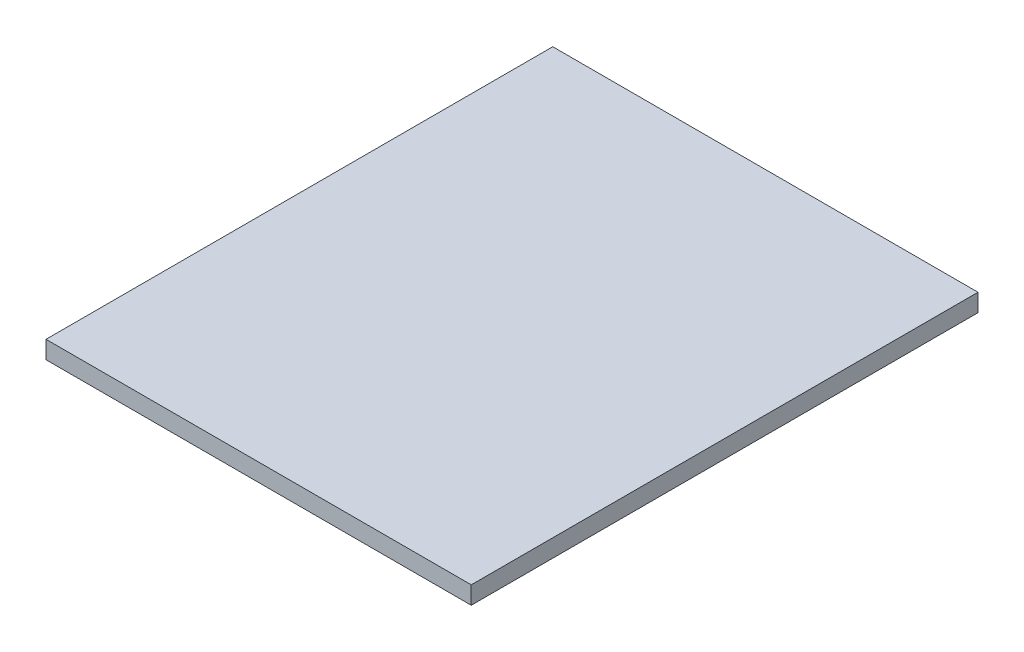
ISO-10303-21;
HEADER;
FILE_DESCRIPTION(('STEP AP214'),'2;1');
FILE_NAME('part.step','',(''),(''),'','','');
FILE_SCHEMA(('AUTOMOTIVE_DESIGN { 1 0 10303 214 1 1 1 1 }'));
ENDSEC;
DATA;
#1=APPLICATION_CONTEXT('core data for automotive mechanical design processes');
#2=APPLICATION_PROTOCOL_DEFINITION('international standard','automotive_design',2000,#1);
#3=PRODUCT_CONTEXT('',#1,'mechanical');
#4=PRODUCT('Part','Part','',(#3));
#5=PRODUCT_RELATED_PRODUCT_CATEGORY('part','',(#4));
#6=PRODUCT_DEFINITION_FORMATION('','',#4);
#7=PRODUCT_DEFINITION_CONTEXT('part definition',#1,'design');
#8=PRODUCT_DEFINITION('design','',#6,#7);
#9=PRODUCT_DEFINITION_SHAPE('','',#8);
#10=(LENGTH_UNIT() NAMED_UNIT(*) SI_UNIT(.MILLI.,.METRE.));
#11=(NAMED_UNIT(*) PLANE_ANGLE_UNIT() SI_UNIT($,.RADIAN.));
#12=(NAMED_UNIT(*) SI_UNIT($,.STERADIAN.) SOLID_ANGLE_UNIT());
#13=UNCERTAINTY_MEASURE_WITH_UNIT(LENGTH_MEASURE(1.E-05),#10,'distance_accuracy_value','');
#14=(GEOMETRIC_REPRESENTATION_CONTEXT(3) GLOBAL_UNCERTAINTY_ASSIGNED_CONTEXT((#13)) GLOBAL_UNIT_ASSIGNED_CONTEXT((#10,
#11,#12)) REPRESENTATION_CONTEXT('',''));
#15=CARTESIAN_POINT('',(0.,0.,0.));
#16=DIRECTION('',(0.,0.,1.));
#17=DIRECTION('',(1.,0.,0.));
#18=AXIS2_PLACEMENT_3D('',#15,#16,#17);
#19=CARTESIAN_POINT('',(38.1,3.175,45.4025));
#20=DIRECTION('',(-1.,0.,0.));
#21=DIRECTION('',(0.,0.,1.));
#22=AXIS2_PLACEMENT_3D('',#19,#20,#21);
#23=PLANE('',#22);
#24=DIRECTION('',(0.,0.,-1.));
#25=VECTOR('',#24,1.);
#26=CARTESIAN_POINT('',(38.1,0.,45.4025));
#27=LINE('',#26,#25);
#28=CARTESIAN_POINT('',(38.1,0.,45.4025));
#29=VERTEX_POINT('',#28);
#30=CARTESIAN_POINT('',(38.1,0.,-45.4025));
#31=VERTEX_POINT('',#30);
#32=EDGE_CURVE('E96',#29,#31,#27,.T.);
#33=ORIENTED_EDGE('',*,*,#32,.T.);
#34=DIRECTION('',(0.,-1.,0.));
#35=VECTOR('',#34,1.);
#36=CARTESIAN_POINT('',(38.1,3.175,-45.4025));
#37=LINE('',#36,#35);
#38=CARTESIAN_POINT('',(38.1,3.175,-45.4025));
#39=VERTEX_POINT('',#38);
#40=EDGE_CURVE('E11',#39,#31,#37,.T.);
#41=ORIENTED_EDGE('',*,*,#40,.F.);
#42=DIRECTION('',(0.,0.,-1.));
#43=VECTOR('',#42,1.);
#44=CARTESIAN_POINT('',(38.1,3.175,45.4025));
#45=LINE('',#44,#43);
#46=CARTESIAN_POINT('',(38.1,3.175,45.4025));
#47=VERTEX_POINT('',#46);
#48=EDGE_CURVE('E84',#47,#39,#45,.T.);
#49=ORIENTED_EDGE('',*,*,#48,.F.);
#50=DIRECTION('',(0.,-1.,0.));
#51=VECTOR('',#50,1.);
#52=CARTESIAN_POINT('',(38.1,3.175,45.4025));
#53=LINE('',#52,#51);
#54=EDGE_CURVE('E92',#47,#29,#53,.T.);
#55=ORIENTED_EDGE('',*,*,#54,.T.);
#56=EDGE_LOOP('',(#33,#41,#49,#55));
#57=FACE_BOUND('',#56,.T.);
#58=ADVANCED_FACE('F33',(#57),#23,.F.);
#59=CARTESIAN_POINT('',(-38.1,3.175,-45.4025));
#60=DIRECTION('',(0.,0.,1.));
#61=DIRECTION('',(1.,0.,0.));
#62=AXIS2_PLACEMENT_3D('',#59,#60,#61);
#63=PLANE('',#62);
#64=DIRECTION('',(-1.,0.,0.));
#65=VECTOR('',#64,1.);
#66=CARTESIAN_POINT('',(-38.1,0.,-45.4025));
#67=LINE('',#66,#65);
#68=CARTESIAN_POINT('',(-38.1,0.,-45.4025));
#69=VERTEX_POINT('',#68);
#70=EDGE_CURVE('E88',#31,#69,#67,.T.);
#71=ORIENTED_EDGE('',*,*,#70,.T.);
#72=DIRECTION('',(0.,-1.,0.));
#73=VECTOR('',#72,1.);
#74=CARTESIAN_POINT('',(-38.1,3.175,-45.4025));
#75=LINE('',#74,#73);
#76=CARTESIAN_POINT('',(-38.1,3.175,-45.4025));
#77=VERTEX_POINT('',#76);
#78=EDGE_CURVE('E41',#77,#69,#75,.T.);
#79=ORIENTED_EDGE('',*,*,#78,.F.);
#80=DIRECTION('',(-1.,0.,0.));
#81=VECTOR('',#80,1.);
#82=CARTESIAN_POINT('',(-38.1,3.175,-45.4025));
#83=LINE('',#82,#81);
#84=EDGE_CURVE('E79',#39,#77,#83,.T.);
#85=ORIENTED_EDGE('',*,*,#84,.F.);
#86=ORIENTED_EDGE('',*,*,#40,.T.);
#87=EDGE_LOOP('',(#71,#79,#85,#86));
#88=FACE_BOUND('',#87,.T.);
#89=ADVANCED_FACE('F87',(#88),#63,.F.);
#90=CARTESIAN_POINT('',(-38.1,3.175,45.4025));
#91=DIRECTION('',(1.,0.,0.));
#92=DIRECTION('',(0.,0.,-1.));
#93=AXIS2_PLACEMENT_3D('',#90,#91,#92);
#94=PLANE('',#93);
#95=DIRECTION('',(0.,0.,1.));
#96=VECTOR('',#95,1.);
#97=CARTESIAN_POINT('',(-38.1,0.,45.4025));
#98=LINE('',#97,#96);
#99=CARTESIAN_POINT('',(-38.1,0.,45.4025));
#100=VERTEX_POINT('',#99);
#101=EDGE_CURVE('E66',#69,#100,#98,.T.);
#102=ORIENTED_EDGE('',*,*,#101,.T.);
#103=DIRECTION('',(0.,-1.,0.));
#104=VECTOR('',#103,1.);
#105=CARTESIAN_POINT('',(-38.1,3.175,45.4025));
#106=LINE('',#105,#104);
#107=CARTESIAN_POINT('',(-38.1,3.175,45.4025));
#108=VERTEX_POINT('',#107);
#109=EDGE_CURVE('E89',#108,#100,#106,.T.);
#110=ORIENTED_EDGE('',*,*,#109,.F.);
#111=DIRECTION('',(0.,0.,1.));
#112=VECTOR('',#111,1.);
#113=CARTESIAN_POINT('',(-38.1,3.175,45.4025));
#114=LINE('',#113,#112);
#115=EDGE_CURVE('E82',#77,#108,#114,.T.);
#116=ORIENTED_EDGE('',*,*,#115,.F.);
#117=ORIENTED_EDGE('',*,*,#78,.T.);
#118=EDGE_LOOP('',(#102,#110,#116,#117));
#119=FACE_BOUND('',#118,.T.);
#120=ADVANCED_FACE('F90',(#119),#94,.F.);
#121=CARTESIAN_POINT('',(-38.1,3.175,45.4025));
#122=DIRECTION('',(0.,0.,-1.));
#123=DIRECTION('',(-1.,0.,0.));
#124=AXIS2_PLACEMENT_3D('',#121,#122,#123);
#125=PLANE('',#124);
#126=DIRECTION('',(1.,0.,0.));
#127=VECTOR('',#126,1.);
#128=CARTESIAN_POINT('',(-38.1,0.,45.4025));
#129=LINE('',#128,#127);
#130=EDGE_CURVE('E72',#100,#29,#129,.T.);
#131=ORIENTED_EDGE('',*,*,#130,.T.);
#132=ORIENTED_EDGE('',*,*,#54,.F.);
#133=DIRECTION('',(1.,0.,0.));
#134=VECTOR('',#133,1.);
#135=CARTESIAN_POINT('',(-38.1,3.175,45.4025));
#136=LINE('',#135,#134);
#137=EDGE_CURVE('E49',#108,#47,#136,.T.);
#138=ORIENTED_EDGE('',*,*,#137,.F.);
#139=ORIENTED_EDGE('',*,*,#109,.T.);
#140=EDGE_LOOP('',(#131,#132,#138,#139));
#141=FACE_BOUND('',#140,.T.);
#142=ADVANCED_FACE('F103',(#141),#125,.F.);
#143=CARTESIAN_POINT('',(0.,3.175,0.));
#144=DIRECTION('',(0.,-1.,0.));
#145=DIRECTION('',(0.,0.,-1.));
#146=AXIS2_PLACEMENT_3D('',#143,#144,#145);
#147=PLANE('',#146);
#148=ORIENTED_EDGE('',*,*,#48,.T.);
#149=ORIENTED_EDGE('',*,*,#84,.T.);
#150=ORIENTED_EDGE('',*,*,#115,.T.);
#151=ORIENTED_EDGE('',*,*,#137,.T.);
#152=EDGE_LOOP('',(#148,#149,#150,#151));
#153=FACE_BOUND('',#152,.T.);
#154=ADVANCED_FACE('F80',(#153),#147,.F.);
#155=CARTESIAN_POINT('',(0.,0.,0.));
#156=DIRECTION('',(0.,-1.,0.));
#157=DIRECTION('',(0.,0.,-1.));
#158=AXIS2_PLACEMENT_3D('',#155,#156,#157);
#159=PLANE('',#158);
#160=ORIENTED_EDGE('',*,*,#32,.F.);
#161=ORIENTED_EDGE('',*,*,#130,.F.);
#162=ORIENTED_EDGE('',*,*,#101,.F.);
#163=ORIENTED_EDGE('',*,*,#70,.F.);
#164=EDGE_LOOP('',(#160,#161,#162,#163));
#165=FACE_BOUND('',#164,.T.);
#166=ADVANCED_FACE('F106',(#165),#159,.T.);
#167=CLOSED_SHELL('',(#58,#89,#120,#142,#154,#166));
#168=MANIFOLD_SOLID_BREP('B2',#167);
#169=ADVANCED_BREP_SHAPE_REPRESENTATION('',(#18,#168),#14);
#170=SHAPE_DEFINITION_REPRESENTATION(#9,#169);
ENDSEC;
END-ISO-10303-21;
